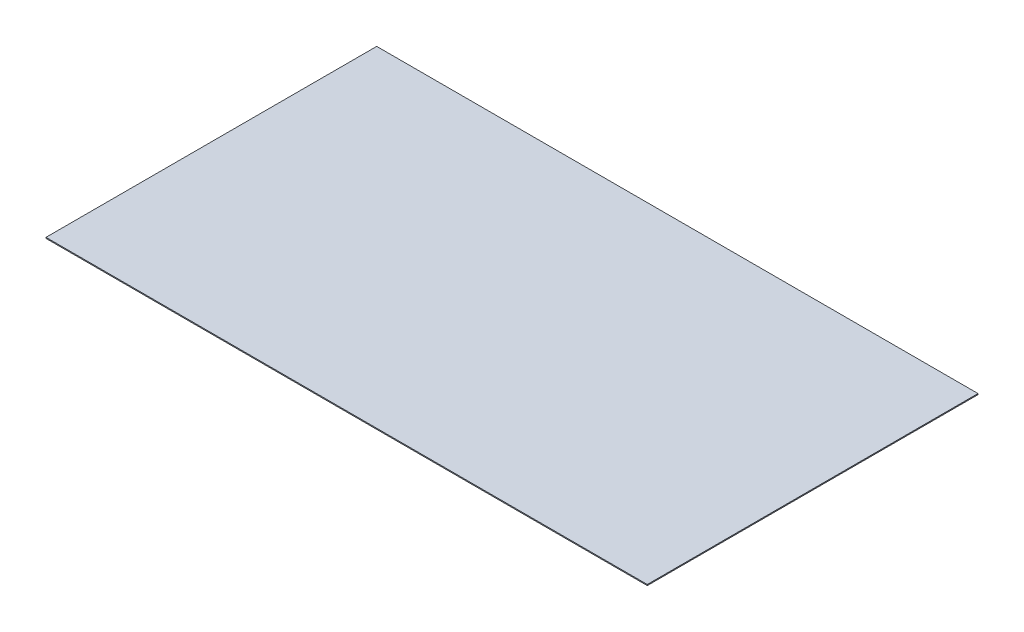
ISO-10303-21;
HEADER;
FILE_DESCRIPTION(('STEP AP214'),'2;1');
FILE_NAME('part.step','',(''),(''),'','','');
FILE_SCHEMA(('AUTOMOTIVE_DESIGN { 1 0 10303 214 1 1 1 1 }'));
ENDSEC;
DATA;
#1=APPLICATION_CONTEXT('core data for automotive mechanical design processes');
#2=APPLICATION_PROTOCOL_DEFINITION('international standard','automotive_design',2000,#1);
#3=PRODUCT_CONTEXT('',#1,'mechanical');
#4=PRODUCT('Part','Part','',(#3));
#5=PRODUCT_RELATED_PRODUCT_CATEGORY('part','',(#4));
#6=PRODUCT_DEFINITION_FORMATION('','',#4);
#7=PRODUCT_DEFINITION_CONTEXT('part definition',#1,'design');
#8=PRODUCT_DEFINITION('design','',#6,#7);
#9=PRODUCT_DEFINITION_SHAPE('','',#8);
#10=(LENGTH_UNIT() NAMED_UNIT(*) SI_UNIT(.MILLI.,.METRE.));
#11=(NAMED_UNIT(*) PLANE_ANGLE_UNIT() SI_UNIT($,.RADIAN.));
#12=(NAMED_UNIT(*) SI_UNIT($,.STERADIAN.) SOLID_ANGLE_UNIT());
#13=UNCERTAINTY_MEASURE_WITH_UNIT(LENGTH_MEASURE(1.E-05),#10,'distance_accuracy_value','');
#14=(GEOMETRIC_REPRESENTATION_CONTEXT(3) GLOBAL_UNCERTAINTY_ASSIGNED_CONTEXT((#13)) GLOBAL_UNIT_ASSIGNED_CONTEXT((#10,
#11,#12)) REPRESENTATION_CONTEXT('',''));
#15=CARTESIAN_POINT('',(0.,0.,0.));
#16=DIRECTION('',(0.,0.,1.));
#17=DIRECTION('',(1.,0.,0.));
#18=AXIS2_PLACEMENT_3D('',#15,#16,#17);
#19=CARTESIAN_POINT('',(38.1,0.127,20.955));
#20=DIRECTION('',(-1.,0.,0.));
#21=DIRECTION('',(0.,0.,1.));
#22=AXIS2_PLACEMENT_3D('',#19,#20,#21);
#23=PLANE('',#22);
#24=DIRECTION('',(0.,0.,-1.));
#25=VECTOR('',#24,1.);
#26=CARTESIAN_POINT('',(38.1,0.,20.955));
#27=LINE('',#26,#25);
#28=CARTESIAN_POINT('',(38.1,0.,20.955));
#29=VERTEX_POINT('',#28);
#30=CARTESIAN_POINT('',(38.1,0.,-20.955));
#31=VERTEX_POINT('',#30);
#32=EDGE_CURVE('E115',#29,#31,#27,.T.);
#33=ORIENTED_EDGE('',*,*,#32,.T.);
#34=DIRECTION('',(0.,-1.,0.));
#35=VECTOR('',#34,1.);
#36=CARTESIAN_POINT('',(38.1,0.127,-20.955));
#37=LINE('',#36,#35);
#38=CARTESIAN_POINT('',(38.1,0.127,-20.955));
#39=VERTEX_POINT('',#38);
#40=EDGE_CURVE('E11',#39,#31,#37,.T.);
#41=ORIENTED_EDGE('',*,*,#40,.F.);
#42=DIRECTION('',(0.,0.,-1.));
#43=VECTOR('',#42,1.);
#44=CARTESIAN_POINT('',(38.1,0.127,20.955));
#45=LINE('',#44,#43);
#46=CARTESIAN_POINT('',(38.1,0.127,20.955));
#47=VERTEX_POINT('',#46);
#48=EDGE_CURVE('E99',#47,#39,#45,.T.);
#49=ORIENTED_EDGE('',*,*,#48,.F.);
#50=DIRECTION('',(0.,-1.,0.));
#51=VECTOR('',#50,1.);
#52=CARTESIAN_POINT('',(38.1,0.127,20.955));
#53=LINE('',#52,#51);
#54=EDGE_CURVE('E111',#47,#29,#53,.T.);
#55=ORIENTED_EDGE('',*,*,#54,.T.);
#56=EDGE_LOOP('',(#33,#41,#49,#55));
#57=FACE_BOUND('',#56,.T.);
#58=ADVANCED_FACE('F47',(#57),#23,.F.);
#59=CARTESIAN_POINT('',(-38.1,0.127,-20.955));
#60=DIRECTION('',(0.,0.,1.));
#61=DIRECTION('',(1.,0.,0.));
#62=AXIS2_PLACEMENT_3D('',#59,#60,#61);
#63=PLANE('',#62);
#64=DIRECTION('',(-1.,0.,0.));
#65=VECTOR('',#64,1.);
#66=CARTESIAN_POINT('',(-38.1,0.,-20.955));
#67=LINE('',#66,#65);
#68=CARTESIAN_POINT('',(-38.1,0.,-20.955));
#69=VERTEX_POINT('',#68);
#70=EDGE_CURVE('E104',#31,#69,#67,.T.);
#71=ORIENTED_EDGE('',*,*,#70,.T.);
#72=DIRECTION('',(0.,-1.,0.));
#73=VECTOR('',#72,1.);
#74=CARTESIAN_POINT('',(-38.1,0.127,-20.955));
#75=LINE('',#74,#73);
#76=CARTESIAN_POINT('',(-38.1,0.127,-20.955));
#77=VERTEX_POINT('',#76);
#78=EDGE_CURVE('E56',#77,#69,#75,.T.);
#79=ORIENTED_EDGE('',*,*,#78,.F.);
#80=DIRECTION('',(-1.,0.,0.));
#81=VECTOR('',#80,1.);
#82=CARTESIAN_POINT('',(-38.1,0.127,-20.955));
#83=LINE('',#82,#81);
#84=EDGE_CURVE('E94',#39,#77,#83,.T.);
#85=ORIENTED_EDGE('',*,*,#84,.F.);
#86=ORIENTED_EDGE('',*,*,#40,.T.);
#87=EDGE_LOOP('',(#71,#79,#85,#86));
#88=FACE_BOUND('',#87,.T.);
#89=ADVANCED_FACE('F103',(#88),#63,.F.);
#90=CARTESIAN_POINT('',(-38.1,0.127,20.955));
#91=DIRECTION('',(1.,0.,0.));
#92=DIRECTION('',(0.,0.,-1.));
#93=AXIS2_PLACEMENT_3D('',#90,#91,#92);
#94=PLANE('',#93);
#95=DIRECTION('',(0.,0.,1.));
#96=VECTOR('',#95,1.);
#97=CARTESIAN_POINT('',(-38.1,0.,20.955));
#98=LINE('',#97,#96);
#99=CARTESIAN_POINT('',(-38.1,0.,20.955));
#100=VERTEX_POINT('',#99);
#101=EDGE_CURVE('E81',#69,#100,#98,.T.);
#102=ORIENTED_EDGE('',*,*,#101,.T.);
#103=DIRECTION('',(0.,-1.,0.));
#104=VECTOR('',#103,1.);
#105=CARTESIAN_POINT('',(-38.1,0.127,20.955));
#106=LINE('',#105,#104);
#107=CARTESIAN_POINT('',(-38.1,0.127,20.955));
#108=VERTEX_POINT('',#107);
#109=EDGE_CURVE('E106',#108,#100,#106,.T.);
#110=ORIENTED_EDGE('',*,*,#109,.F.);
#111=DIRECTION('',(0.,0.,1.));
#112=VECTOR('',#111,1.);
#113=CARTESIAN_POINT('',(-38.1,0.127,20.955));
#114=LINE('',#113,#112);
#115=EDGE_CURVE('E97',#77,#108,#114,.T.);
#116=ORIENTED_EDGE('',*,*,#115,.F.);
#117=ORIENTED_EDGE('',*,*,#78,.T.);
#118=EDGE_LOOP('',(#102,#110,#116,#117));
#119=FACE_BOUND('',#118,.T.);
#120=ADVANCED_FACE('F107',(#119),#94,.F.);
#121=CARTESIAN_POINT('',(-38.1,0.127,20.955));
#122=DIRECTION('',(0.,0.,-1.));
#123=DIRECTION('',(-1.,0.,0.));
#124=AXIS2_PLACEMENT_3D('',#121,#122,#123);
#125=PLANE('',#124);
#126=DIRECTION('',(1.,0.,0.));
#127=VECTOR('',#126,1.);
#128=CARTESIAN_POINT('',(-38.1,0.,20.955));
#129=LINE('',#128,#127);
#130=EDGE_CURVE('E87',#100,#29,#129,.T.);
#131=ORIENTED_EDGE('',*,*,#130,.T.);
#132=ORIENTED_EDGE('',*,*,#54,.F.);
#133=DIRECTION('',(1.,0.,0.));
#134=VECTOR('',#133,1.);
#135=CARTESIAN_POINT('',(-38.1,0.127,20.955));
#136=LINE('',#135,#134);
#137=EDGE_CURVE('E64',#108,#47,#136,.T.);
#138=ORIENTED_EDGE('',*,*,#137,.F.);
#139=ORIENTED_EDGE('',*,*,#109,.T.);
#140=EDGE_LOOP('',(#131,#132,#138,#139));
#141=FACE_BOUND('',#140,.T.);
#142=ADVANCED_FACE('F128',(#141),#125,.F.);
#143=CARTESIAN_POINT('',(0.,0.127,0.));
#144=DIRECTION('',(0.,-1.,0.));
#145=DIRECTION('',(0.,0.,-1.));
#146=AXIS2_PLACEMENT_3D('',#143,#144,#145);
#147=PLANE('',#146);
#148=ORIENTED_EDGE('',*,*,#48,.T.);
#149=ORIENTED_EDGE('',*,*,#84,.T.);
#150=ORIENTED_EDGE('',*,*,#115,.T.);
#151=ORIENTED_EDGE('',*,*,#137,.T.);
#152=EDGE_LOOP('',(#148,#149,#150,#151));
#153=FACE_BOUND('',#152,.T.);
#154=ADVANCED_FACE('F95',(#153),#147,.F.);
#155=CARTESIAN_POINT('',(0.,0.,0.));
#156=DIRECTION('',(0.,-1.,0.));
#157=DIRECTION('',(0.,0.,-1.));
#158=AXIS2_PLACEMENT_3D('',#155,#156,#157);
#159=PLANE('',#158);
#160=ORIENTED_EDGE('',*,*,#32,.F.);
#161=ORIENTED_EDGE('',*,*,#130,.F.);
#162=ORIENTED_EDGE('',*,*,#101,.F.);
#163=ORIENTED_EDGE('',*,*,#70,.F.);
#164=EDGE_LOOP('',(#160,#161,#162,#163));
#165=FACE_BOUND('',#164,.T.);
#166=ADVANCED_FACE('F131',(#165),#159,.T.);
#167=CLOSED_SHELL('',(#58,#89,#120,#142,#154,#166));
#168=MANIFOLD_SOLID_BREP('B2',#167);
#169=ADVANCED_BREP_SHAPE_REPRESENTATION('',(#18,#168),#14);
#170=SHAPE_DEFINITION_REPRESENTATION(#9,#169);
ENDSEC;
END-ISO-10303-21;
